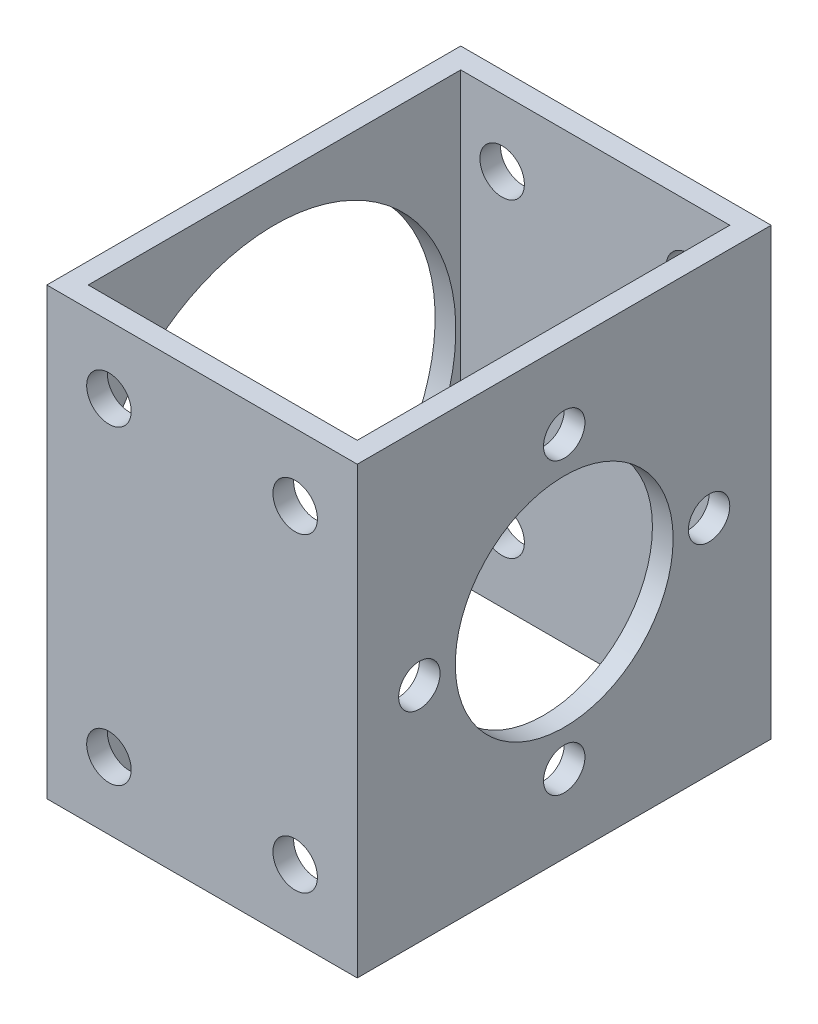
ISO-10303-21;
HEADER;
FILE_DESCRIPTION(('STEP AP214'),'2;1');
FILE_NAME('part.step','',(''),(''),'','','');
FILE_SCHEMA(('AUTOMOTIVE_DESIGN { 1 0 10303 214 1 1 1 1 }'));
ENDSEC;
DATA;
#1=APPLICATION_CONTEXT('core data for automotive mechanical design processes');
#2=APPLICATION_PROTOCOL_DEFINITION('international standard','automotive_design',2000,#1);
#3=PRODUCT_CONTEXT('',#1,'mechanical');
#4=PRODUCT('Part','Part','',(#3));
#5=PRODUCT_RELATED_PRODUCT_CATEGORY('part','',(#4));
#6=PRODUCT_DEFINITION_FORMATION('','',#4);
#7=PRODUCT_DEFINITION_CONTEXT('part definition',#1,'design');
#8=PRODUCT_DEFINITION('design','',#6,#7);
#9=PRODUCT_DEFINITION_SHAPE('','',#8);
#10=(LENGTH_UNIT() NAMED_UNIT(*) SI_UNIT(.MILLI.,.METRE.));
#11=(NAMED_UNIT(*) PLANE_ANGLE_UNIT() SI_UNIT($,.RADIAN.));
#12=(NAMED_UNIT(*) SI_UNIT($,.STERADIAN.) SOLID_ANGLE_UNIT());
#13=UNCERTAINTY_MEASURE_WITH_UNIT(LENGTH_MEASURE(1.E-05),#10,'distance_accuracy_value','');
#14=(GEOMETRIC_REPRESENTATION_CONTEXT(3) GLOBAL_UNCERTAINTY_ASSIGNED_CONTEXT((#13)) GLOBAL_UNIT_ASSIGNED_CONTEXT((#10,
#11,#12)) REPRESENTATION_CONTEXT('',''));
#15=CARTESIAN_POINT('',(0.,0.,0.));
#16=DIRECTION('',(0.,0.,1.));
#17=DIRECTION('',(1.,0.,0.));
#18=AXIS2_PLACEMENT_3D('',#15,#16,#17);
#19=CARTESIAN_POINT('',(0.,43.,0.));
#20=DIRECTION('',(0.,1.,0.));
#21=DIRECTION('',(0.,0.,1.));
#22=AXIS2_PLACEMENT_3D('',#19,#20,#21);
#23=PLANE('',#22);
#24=DIRECTION('',(0.,0.,1.));
#25=VECTOR('',#24,1.);
#26=CARTESIAN_POINT('',(0.,43.,0.));
#27=LINE('',#26,#25);
#28=CARTESIAN_POINT('',(0.,43.,0.));
#29=VERTEX_POINT('',#28);
#30=CARTESIAN_POINT('',(0.,43.,40.));
#31=VERTEX_POINT('',#30);
#32=EDGE_CURVE('E139',#29,#31,#27,.T.);
#33=ORIENTED_EDGE('',*,*,#32,.T.);
#34=DIRECTION('',(1.,0.,0.));
#35=VECTOR('',#34,1.);
#36=CARTESIAN_POINT('',(0.,43.,40.));
#37=LINE('',#36,#35);
#38=CARTESIAN_POINT('',(30.,43.,40.));
#39=VERTEX_POINT('',#38);
#40=EDGE_CURVE('E142',#31,#39,#37,.T.);
#41=ORIENTED_EDGE('',*,*,#40,.T.);
#42=DIRECTION('',(0.,0.,-1.));
#43=VECTOR('',#42,1.);
#44=CARTESIAN_POINT('',(30.,43.,0.));
#45=LINE('',#44,#43);
#46=CARTESIAN_POINT('',(30.,43.,0.));
#47=VERTEX_POINT('',#46);
#48=EDGE_CURVE('E145',#39,#47,#45,.T.);
#49=ORIENTED_EDGE('',*,*,#48,.T.);
#50=DIRECTION('',(-1.,0.,0.));
#51=VECTOR('',#50,1.);
#52=CARTESIAN_POINT('',(0.,43.,0.));
#53=LINE('',#52,#51);
#54=EDGE_CURVE('E147',#47,#29,#53,.T.);
#55=ORIENTED_EDGE('',*,*,#54,.T.);
#56=EDGE_LOOP('',(#33,#41,#49,#55));
#57=FACE_BOUND('',#56,.T.);
#58=DIRECTION('',(1.,0.,0.));
#59=VECTOR('',#58,1.);
#60=CARTESIAN_POINT('',(2.,43.,38.));
#61=LINE('',#60,#59);
#62=CARTESIAN_POINT('',(2.,43.,38.));
#63=VERTEX_POINT('',#62);
#64=CARTESIAN_POINT('',(28.,43.,38.));
#65=VERTEX_POINT('',#64);
#66=EDGE_CURVE('E109',#63,#65,#61,.T.);
#67=ORIENTED_EDGE('',*,*,#66,.F.);
#68=DIRECTION('',(0.,0.,1.));
#69=VECTOR('',#68,1.);
#70=CARTESIAN_POINT('',(2.,43.,2.));
#71=LINE('',#70,#69);
#72=CARTESIAN_POINT('',(2.,43.,2.));
#73=VERTEX_POINT('',#72);
#74=EDGE_CURVE('E101',#73,#63,#71,.T.);
#75=ORIENTED_EDGE('',*,*,#74,.F.);
#76=DIRECTION('',(-1.,0.,0.));
#77=VECTOR('',#76,1.);
#78=CARTESIAN_POINT('',(2.,43.,2.));
#79=LINE('',#78,#77);
#80=CARTESIAN_POINT('',(28.,43.,2.));
#81=VERTEX_POINT('',#80);
#82=EDGE_CURVE('E123',#81,#73,#79,.T.);
#83=ORIENTED_EDGE('',*,*,#82,.F.);
#84=DIRECTION('',(0.,0.,-1.));
#85=VECTOR('',#84,1.);
#86=CARTESIAN_POINT('',(28.,43.,2.));
#87=LINE('',#86,#85);
#88=EDGE_CURVE('E121',#65,#81,#87,.T.);
#89=ORIENTED_EDGE('',*,*,#88,.F.);
#90=EDGE_LOOP('',(#67,#75,#83,#89));
#91=FACE_BOUND('',#90,.T.);
#92=ADVANCED_FACE('F34',(#57,#91),#23,.T.);
#93=CARTESIAN_POINT('',(0.,0.,0.));
#94=DIRECTION('',(0.,1.,0.));
#95=DIRECTION('',(0.,0.,1.));
#96=AXIS2_PLACEMENT_3D('',#93,#94,#95);
#97=PLANE('',#96);
#98=DIRECTION('',(0.,0.,1.));
#99=VECTOR('',#98,1.);
#100=CARTESIAN_POINT('',(0.,0.,0.));
#101=LINE('',#100,#99);
#102=CARTESIAN_POINT('',(0.,0.,0.));
#103=VERTEX_POINT('',#102);
#104=CARTESIAN_POINT('',(0.,0.,40.));
#105=VERTEX_POINT('',#104);
#106=EDGE_CURVE('E117',#103,#105,#101,.T.);
#107=ORIENTED_EDGE('',*,*,#106,.F.);
#108=DIRECTION('',(-1.,0.,0.));
#109=VECTOR('',#108,1.);
#110=CARTESIAN_POINT('',(0.,0.,0.));
#111=LINE('',#110,#109);
#112=CARTESIAN_POINT('',(30.,0.,0.));
#113=VERTEX_POINT('',#112);
#114=EDGE_CURVE('E143',#113,#103,#111,.T.);
#115=ORIENTED_EDGE('',*,*,#114,.F.);
#116=DIRECTION('',(0.,0.,-1.));
#117=VECTOR('',#116,1.);
#118=CARTESIAN_POINT('',(30.,0.,0.));
#119=LINE('',#118,#117);
#120=CARTESIAN_POINT('',(30.,0.,40.));
#121=VERTEX_POINT('',#120);
#122=EDGE_CURVE('E154',#121,#113,#119,.T.);
#123=ORIENTED_EDGE('',*,*,#122,.F.);
#124=DIRECTION('',(1.,0.,0.));
#125=VECTOR('',#124,1.);
#126=CARTESIAN_POINT('',(0.,0.,40.));
#127=LINE('',#126,#125);
#128=EDGE_CURVE('E152',#105,#121,#127,.T.);
#129=ORIENTED_EDGE('',*,*,#128,.F.);
#130=EDGE_LOOP('',(#107,#115,#123,#129));
#131=FACE_BOUND('',#130,.T.);
#132=DIRECTION('',(0.,0.,1.));
#133=VECTOR('',#132,1.);
#134=CARTESIAN_POINT('',(2.,0.,2.));
#135=LINE('',#134,#133);
#136=CARTESIAN_POINT('',(2.,0.,2.));
#137=VERTEX_POINT('',#136);
#138=CARTESIAN_POINT('',(2.,0.,38.));
#139=VERTEX_POINT('',#138);
#140=EDGE_CURVE('E59',#137,#139,#135,.T.);
#141=ORIENTED_EDGE('',*,*,#140,.T.);
#142=DIRECTION('',(1.,0.,0.));
#143=VECTOR('',#142,1.);
#144=CARTESIAN_POINT('',(2.,0.,38.));
#145=LINE('',#144,#143);
#146=CARTESIAN_POINT('',(28.,0.,38.));
#147=VERTEX_POINT('',#146);
#148=EDGE_CURVE('E116',#139,#147,#145,.T.);
#149=ORIENTED_EDGE('',*,*,#148,.T.);
#150=DIRECTION('',(0.,0.,-1.));
#151=VECTOR('',#150,1.);
#152=CARTESIAN_POINT('',(28.,0.,2.));
#153=LINE('',#152,#151);
#154=CARTESIAN_POINT('',(28.,0.,2.));
#155=VERTEX_POINT('',#154);
#156=EDGE_CURVE('E131',#147,#155,#153,.T.);
#157=ORIENTED_EDGE('',*,*,#156,.T.);
#158=DIRECTION('',(-1.,0.,0.));
#159=VECTOR('',#158,1.);
#160=CARTESIAN_POINT('',(2.,0.,2.));
#161=LINE('',#160,#159);
#162=EDGE_CURVE('E110',#155,#137,#161,.T.);
#163=ORIENTED_EDGE('',*,*,#162,.T.);
#164=EDGE_LOOP('',(#141,#149,#157,#163));
#165=FACE_BOUND('',#164,.T.);
#166=ADVANCED_FACE('F225',(#131,#165),#97,.F.);
#167=CARTESIAN_POINT('',(0.,43.,0.));
#168=DIRECTION('',(1.,0.,0.));
#169=DIRECTION('',(0.,0.,-1.));
#170=AXIS2_PLACEMENT_3D('',#167,#168,#169);
#171=PLANE('',#170);
#172=CARTESIAN_POINT('',(0.,21.5,20.));
#173=DIRECTION('',(-1.,0.,0.));
#174=DIRECTION('',(0.,0.,1.));
#175=AXIS2_PLACEMENT_3D('',#172,#173,#174);
#176=CIRCLE('',#175,17.525);
#177=CARTESIAN_POINT('',(0.,21.5,37.525));
#178=VERTEX_POINT('',#177);
#179=EDGE_CURVE('E358',#178,#178,#176,.T.);
#180=ORIENTED_EDGE('',*,*,#179,.F.);
#181=EDGE_LOOP('',(#180));
#182=FACE_BOUND('',#181,.T.);
#183=ORIENTED_EDGE('',*,*,#106,.T.);
#184=DIRECTION('',(0.,-1.,0.));
#185=VECTOR('',#184,1.);
#186=CARTESIAN_POINT('',(0.,43.,40.));
#187=LINE('',#186,#185);
#188=EDGE_CURVE('E11',#31,#105,#187,.T.);
#189=ORIENTED_EDGE('',*,*,#188,.F.);
#190=ORIENTED_EDGE('',*,*,#32,.F.);
#191=DIRECTION('',(0.,-1.,0.));
#192=VECTOR('',#191,1.);
#193=CARTESIAN_POINT('',(0.,43.,0.));
#194=LINE('',#193,#192);
#195=EDGE_CURVE('E149',#29,#103,#194,.T.);
#196=ORIENTED_EDGE('',*,*,#195,.T.);
#197=EDGE_LOOP('',(#183,#189,#190,#196));
#198=FACE_BOUND('',#197,.T.);
#199=ADVANCED_FACE('F36',(#182,#198),#171,.F.);
#200=CARTESIAN_POINT('',(0.,43.,40.));
#201=DIRECTION('',(0.,0.,-1.));
#202=DIRECTION('',(-1.,0.,0.));
#203=AXIS2_PLACEMENT_3D('',#200,#201,#202);
#204=PLANE('',#203);
#205=CARTESIAN_POINT('',(6.,36.5,40.));
#206=DIRECTION('',(0.,0.,-1.));
#207=DIRECTION('',(-1.,0.,0.));
#208=AXIS2_PLACEMENT_3D('',#205,#206,#207);
#209=CIRCLE('',#208,2.15);
#210=CARTESIAN_POINT('',(3.85,36.5,40.));
#211=VERTEX_POINT('',#210);
#212=EDGE_CURVE('E249',#211,#211,#209,.T.);
#213=ORIENTED_EDGE('',*,*,#212,.T.);
#214=EDGE_LOOP('',(#213));
#215=FACE_BOUND('',#214,.T.);
#216=CARTESIAN_POINT('',(24.,36.5,40.));
#217=DIRECTION('',(0.,0.,-1.));
#218=DIRECTION('',(-1.,0.,0.));
#219=AXIS2_PLACEMENT_3D('',#216,#217,#218);
#220=CIRCLE('',#219,2.15);
#221=CARTESIAN_POINT('',(21.85,36.5,40.));
#222=VERTEX_POINT('',#221);
#223=EDGE_CURVE('E175',#222,#222,#220,.T.);
#224=ORIENTED_EDGE('',*,*,#223,.T.);
#225=EDGE_LOOP('',(#224));
#226=FACE_BOUND('',#225,.T.);
#227=CARTESIAN_POINT('',(24.,6.5,40.));
#228=DIRECTION('',(0.,0.,-1.));
#229=DIRECTION('',(-1.,0.,0.));
#230=AXIS2_PLACEMENT_3D('',#227,#228,#229);
#231=CIRCLE('',#230,2.15);
#232=CARTESIAN_POINT('',(21.85,6.5,40.));
#233=VERTEX_POINT('',#232);
#234=EDGE_CURVE('E171',#233,#233,#231,.T.);
#235=ORIENTED_EDGE('',*,*,#234,.T.);
#236=EDGE_LOOP('',(#235));
#237=FACE_BOUND('',#236,.T.);
#238=CARTESIAN_POINT('',(6.,6.5,40.));
#239=DIRECTION('',(0.,0.,-1.));
#240=DIRECTION('',(-1.,0.,0.));
#241=AXIS2_PLACEMENT_3D('',#238,#239,#240);
#242=CIRCLE('',#241,2.15);
#243=CARTESIAN_POINT('',(3.85,6.5,40.));
#244=VERTEX_POINT('',#243);
#245=EDGE_CURVE('E167',#244,#244,#242,.T.);
#246=ORIENTED_EDGE('',*,*,#245,.T.);
#247=EDGE_LOOP('',(#246));
#248=FACE_BOUND('',#247,.T.);
#249=ORIENTED_EDGE('',*,*,#128,.T.);
#250=DIRECTION('',(0.,-1.,0.));
#251=VECTOR('',#250,1.);
#252=CARTESIAN_POINT('',(30.,43.,40.));
#253=LINE('',#252,#251);
#254=EDGE_CURVE('E43',#39,#121,#253,.T.);
#255=ORIENTED_EDGE('',*,*,#254,.F.);
#256=ORIENTED_EDGE('',*,*,#40,.F.);
#257=ORIENTED_EDGE('',*,*,#188,.T.);
#258=EDGE_LOOP('',(#249,#255,#256,#257));
#259=FACE_BOUND('',#258,.T.);
#260=ADVANCED_FACE('F239',(#215,#226,#237,#248,#259),#204,.F.);
#261=CARTESIAN_POINT('',(30.,43.,0.));
#262=DIRECTION('',(-1.,0.,0.));
#263=DIRECTION('',(0.,0.,1.));
#264=AXIS2_PLACEMENT_3D('',#261,#262,#263);
#265=PLANE('',#264);
#266=CARTESIAN_POINT('',(30.,35.5,20.));
#267=DIRECTION('',(1.,0.,0.));
#268=DIRECTION('',(0.,0.,-1.));
#269=AXIS2_PLACEMENT_3D('',#266,#267,#268);
#270=CIRCLE('',#269,2.);
#271=CARTESIAN_POINT('',(30.,35.5,18.));
#272=VERTEX_POINT('',#271);
#273=EDGE_CURVE('E327',#272,#272,#270,.T.);
#274=ORIENTED_EDGE('',*,*,#273,.F.);
#275=EDGE_LOOP('',(#274));
#276=FACE_BOUND('',#275,.T.);
#277=CARTESIAN_POINT('',(30.,21.5,34.));
#278=DIRECTION('',(1.,0.,0.));
#279=DIRECTION('',(0.,0.,-1.));
#280=AXIS2_PLACEMENT_3D('',#277,#278,#279);
#281=CIRCLE('',#280,2.);
#282=CARTESIAN_POINT('',(30.,21.5,32.));
#283=VERTEX_POINT('',#282);
#284=EDGE_CURVE('E331',#283,#283,#281,.T.);
#285=ORIENTED_EDGE('',*,*,#284,.F.);
#286=EDGE_LOOP('',(#285));
#287=FACE_BOUND('',#286,.T.);
#288=CARTESIAN_POINT('',(30.,7.5,20.));
#289=DIRECTION('',(1.,0.,0.));
#290=DIRECTION('',(0.,0.,-1.));
#291=AXIS2_PLACEMENT_3D('',#288,#289,#290);
#292=CIRCLE('',#291,2.);
#293=CARTESIAN_POINT('',(30.,7.5,18.));
#294=VERTEX_POINT('',#293);
#295=EDGE_CURVE('E338',#294,#294,#292,.T.);
#296=ORIENTED_EDGE('',*,*,#295,.F.);
#297=EDGE_LOOP('',(#296));
#298=FACE_BOUND('',#297,.T.);
#299=CARTESIAN_POINT('',(30.,21.5,5.99999999999999));
#300=DIRECTION('',(1.,0.,0.));
#301=DIRECTION('',(0.,0.,-1.));
#302=AXIS2_PLACEMENT_3D('',#299,#300,#301);
#303=CIRCLE('',#302,2.);
#304=CARTESIAN_POINT('',(30.,21.5,3.99999999999999));
#305=VERTEX_POINT('',#304);
#306=EDGE_CURVE('E344',#305,#305,#303,.T.);
#307=ORIENTED_EDGE('',*,*,#306,.F.);
#308=EDGE_LOOP('',(#307));
#309=FACE_BOUND('',#308,.T.);
#310=CARTESIAN_POINT('',(30.,21.5,20.));
#311=DIRECTION('',(1.,0.,0.));
#312=DIRECTION('',(0.,0.,-1.));
#313=AXIS2_PLACEMENT_3D('',#310,#311,#312);
#314=CIRCLE('',#313,10.525);
#315=CARTESIAN_POINT('',(30.,21.5,9.475));
#316=VERTEX_POINT('',#315);
#317=EDGE_CURVE('E350',#316,#316,#314,.T.);
#318=ORIENTED_EDGE('',*,*,#317,.F.);
#319=EDGE_LOOP('',(#318));
#320=FACE_BOUND('',#319,.T.);
#321=ORIENTED_EDGE('',*,*,#122,.T.);
#322=DIRECTION('',(0.,-1.,0.));
#323=VECTOR('',#322,1.);
#324=CARTESIAN_POINT('',(30.,43.,0.));
#325=LINE('',#324,#323);
#326=EDGE_CURVE('E159',#47,#113,#325,.T.);
#327=ORIENTED_EDGE('',*,*,#326,.F.);
#328=ORIENTED_EDGE('',*,*,#48,.F.);
#329=ORIENTED_EDGE('',*,*,#254,.T.);
#330=EDGE_LOOP('',(#321,#327,#328,#329));
#331=FACE_BOUND('',#330,.T.);
#332=ADVANCED_FACE('F236',(#276,#287,#298,#309,#320,#331),#265,.F.);
#333=CARTESIAN_POINT('',(0.,43.,0.));
#334=DIRECTION('',(0.,0.,1.));
#335=DIRECTION('',(1.,0.,0.));
#336=AXIS2_PLACEMENT_3D('',#333,#334,#335);
#337=PLANE('',#336);
#338=CARTESIAN_POINT('',(6.,36.5,0.));
#339=DIRECTION('',(0.,0.,-1.));
#340=DIRECTION('',(-1.,0.,0.));
#341=AXIS2_PLACEMENT_3D('',#338,#339,#340);
#342=CIRCLE('',#341,2.15);
#343=CARTESIAN_POINT('',(3.85,36.5,0.));
#344=VERTEX_POINT('',#343);
#345=EDGE_CURVE('E361',#344,#344,#342,.T.);
#346=ORIENTED_EDGE('',*,*,#345,.F.);
#347=EDGE_LOOP('',(#346));
#348=FACE_BOUND('',#347,.T.);
#349=CARTESIAN_POINT('',(24.,36.5,0.));
#350=DIRECTION('',(0.,0.,-1.));
#351=DIRECTION('',(-1.,0.,0.));
#352=AXIS2_PLACEMENT_3D('',#349,#350,#351);
#353=CIRCLE('',#352,2.15);
#354=CARTESIAN_POINT('',(21.85,36.5,0.));
#355=VERTEX_POINT('',#354);
#356=EDGE_CURVE('E182',#355,#355,#353,.T.);
#357=ORIENTED_EDGE('',*,*,#356,.F.);
#358=EDGE_LOOP('',(#357));
#359=FACE_BOUND('',#358,.T.);
#360=CARTESIAN_POINT('',(24.,6.5,0.));
#361=DIRECTION('',(0.,0.,-1.));
#362=DIRECTION('',(-1.,0.,0.));
#363=AXIS2_PLACEMENT_3D('',#360,#361,#362);
#364=CIRCLE('',#363,2.15);
#365=CARTESIAN_POINT('',(21.85,6.5,0.));
#366=VERTEX_POINT('',#365);
#367=EDGE_CURVE('E179',#366,#366,#364,.T.);
#368=ORIENTED_EDGE('',*,*,#367,.F.);
#369=EDGE_LOOP('',(#368));
#370=FACE_BOUND('',#369,.T.);
#371=CARTESIAN_POINT('',(6.,6.5,0.));
#372=DIRECTION('',(0.,0.,-1.));
#373=DIRECTION('',(-1.,0.,0.));
#374=AXIS2_PLACEMENT_3D('',#371,#372,#373);
#375=CIRCLE('',#374,2.15);
#376=CARTESIAN_POINT('',(3.85,6.5,0.));
#377=VERTEX_POINT('',#376);
#378=EDGE_CURVE('E198',#377,#377,#375,.T.);
#379=ORIENTED_EDGE('',*,*,#378,.F.);
#380=EDGE_LOOP('',(#379));
#381=FACE_BOUND('',#380,.T.);
#382=ORIENTED_EDGE('',*,*,#114,.T.);
#383=ORIENTED_EDGE('',*,*,#195,.F.);
#384=ORIENTED_EDGE('',*,*,#54,.F.);
#385=ORIENTED_EDGE('',*,*,#326,.T.);
#386=EDGE_LOOP('',(#382,#383,#384,#385));
#387=FACE_BOUND('',#386,.T.);
#388=ADVANCED_FACE('F219',(#348,#359,#370,#381,#387),#337,.F.);
#389=CARTESIAN_POINT('',(2.,43.,2.));
#390=DIRECTION('',(1.,0.,0.));
#391=DIRECTION('',(0.,0.,-1.));
#392=AXIS2_PLACEMENT_3D('',#389,#390,#391);
#393=PLANE('',#392);
#394=CARTESIAN_POINT('',(2.,21.5,20.));
#395=DIRECTION('',(1.,0.,0.));
#396=DIRECTION('',(0.,0.,-1.));
#397=AXIS2_PLACEMENT_3D('',#394,#395,#396);
#398=CIRCLE('',#397,17.525);
#399=CARTESIAN_POINT('',(2.,21.5,37.525));
#400=VERTEX_POINT('',#399);
#401=EDGE_CURVE('E353',#400,#400,#398,.F.);
#402=ORIENTED_EDGE('',*,*,#401,.T.);
#403=EDGE_LOOP('',(#402));
#404=FACE_BOUND('',#403,.T.);
#405=ORIENTED_EDGE('',*,*,#140,.F.);
#406=DIRECTION('',(0.,-1.,0.));
#407=VECTOR('',#406,1.);
#408=CARTESIAN_POINT('',(2.,43.,2.));
#409=LINE('',#408,#407);
#410=EDGE_CURVE('E105',#73,#137,#409,.T.);
#411=ORIENTED_EDGE('',*,*,#410,.F.);
#412=ORIENTED_EDGE('',*,*,#74,.T.);
#413=DIRECTION('',(0.,-1.,0.));
#414=VECTOR('',#413,1.);
#415=CARTESIAN_POINT('',(2.,43.,38.));
#416=LINE('',#415,#414);
#417=EDGE_CURVE('E104',#63,#139,#416,.T.);
#418=ORIENTED_EDGE('',*,*,#417,.T.);
#419=EDGE_LOOP('',(#405,#411,#412,#418));
#420=FACE_BOUND('',#419,.T.);
#421=ADVANCED_FACE('F103',(#404,#420),#393,.T.);
#422=CARTESIAN_POINT('',(2.,43.,38.));
#423=DIRECTION('',(0.,0.,-1.));
#424=DIRECTION('',(-1.,0.,0.));
#425=AXIS2_PLACEMENT_3D('',#422,#423,#424);
#426=PLANE('',#425);
#427=CARTESIAN_POINT('',(6.,36.5,38.));
#428=DIRECTION('',(0.,0.,-1.));
#429=DIRECTION('',(-1.,0.,0.));
#430=AXIS2_PLACEMENT_3D('',#427,#428,#429);
#431=CIRCLE('',#430,2.15);
#432=CARTESIAN_POINT('',(3.85,36.5,38.));
#433=VERTEX_POINT('',#432);
#434=EDGE_CURVE('E187',#433,#433,#431,.T.);
#435=ORIENTED_EDGE('',*,*,#434,.F.);
#436=EDGE_LOOP('',(#435));
#437=FACE_BOUND('',#436,.T.);
#438=CARTESIAN_POINT('',(24.,36.5,38.));
#439=DIRECTION('',(0.,0.,-1.));
#440=DIRECTION('',(-1.,0.,0.));
#441=AXIS2_PLACEMENT_3D('',#438,#439,#440);
#442=CIRCLE('',#441,2.15);
#443=CARTESIAN_POINT('',(21.85,36.5,38.));
#444=VERTEX_POINT('',#443);
#445=EDGE_CURVE('E174',#444,#444,#442,.T.);
#446=ORIENTED_EDGE('',*,*,#445,.F.);
#447=EDGE_LOOP('',(#446));
#448=FACE_BOUND('',#447,.T.);
#449=CARTESIAN_POINT('',(24.,6.5,38.));
#450=DIRECTION('',(0.,0.,-1.));
#451=DIRECTION('',(-1.,0.,0.));
#452=AXIS2_PLACEMENT_3D('',#449,#450,#451);
#453=CIRCLE('',#452,2.15);
#454=CARTESIAN_POINT('',(21.85,6.5,38.));
#455=VERTEX_POINT('',#454);
#456=EDGE_CURVE('E170',#455,#455,#453,.T.);
#457=ORIENTED_EDGE('',*,*,#456,.F.);
#458=EDGE_LOOP('',(#457));
#459=FACE_BOUND('',#458,.T.);
#460=CARTESIAN_POINT('',(6.,6.5,38.));
#461=DIRECTION('',(0.,0.,-1.));
#462=DIRECTION('',(-1.,0.,0.));
#463=AXIS2_PLACEMENT_3D('',#460,#461,#462);
#464=CIRCLE('',#463,2.15);
#465=CARTESIAN_POINT('',(3.85,6.5,38.));
#466=VERTEX_POINT('',#465);
#467=EDGE_CURVE('E129',#466,#466,#464,.T.);
#468=ORIENTED_EDGE('',*,*,#467,.F.);
#469=EDGE_LOOP('',(#468));
#470=FACE_BOUND('',#469,.T.);
#471=ORIENTED_EDGE('',*,*,#148,.F.);
#472=ORIENTED_EDGE('',*,*,#417,.F.);
#473=ORIENTED_EDGE('',*,*,#66,.T.);
#474=DIRECTION('',(0.,-1.,0.));
#475=VECTOR('',#474,1.);
#476=CARTESIAN_POINT('',(28.,43.,38.));
#477=LINE('',#476,#475);
#478=EDGE_CURVE('E118',#65,#147,#477,.T.);
#479=ORIENTED_EDGE('',*,*,#478,.T.);
#480=EDGE_LOOP('',(#471,#472,#473,#479));
#481=FACE_BOUND('',#480,.T.);
#482=ADVANCED_FACE('F113',(#437,#448,#459,#470,#481),#426,.T.);
#483=CARTESIAN_POINT('',(28.,43.,2.));
#484=DIRECTION('',(-1.,0.,0.));
#485=DIRECTION('',(0.,0.,1.));
#486=AXIS2_PLACEMENT_3D('',#483,#484,#485);
#487=PLANE('',#486);
#488=CARTESIAN_POINT('',(28.,35.5,20.));
#489=DIRECTION('',(-1.,0.,0.));
#490=DIRECTION('',(0.,0.,1.));
#491=AXIS2_PLACEMENT_3D('',#488,#489,#490);
#492=CIRCLE('',#491,2.);
#493=CARTESIAN_POINT('',(28.,35.5,22.));
#494=VERTEX_POINT('',#493);
#495=EDGE_CURVE('E324',#494,#494,#492,.F.);
#496=ORIENTED_EDGE('',*,*,#495,.T.);
#497=EDGE_LOOP('',(#496));
#498=FACE_BOUND('',#497,.T.);
#499=CARTESIAN_POINT('',(28.,21.5,34.));
#500=DIRECTION('',(-1.,0.,0.));
#501=DIRECTION('',(0.,0.,1.));
#502=AXIS2_PLACEMENT_3D('',#499,#500,#501);
#503=CIRCLE('',#502,2.);
#504=CARTESIAN_POINT('',(28.,21.5,36.));
#505=VERTEX_POINT('',#504);
#506=EDGE_CURVE('E328',#505,#505,#503,.F.);
#507=ORIENTED_EDGE('',*,*,#506,.T.);
#508=EDGE_LOOP('',(#507));
#509=FACE_BOUND('',#508,.T.);
#510=CARTESIAN_POINT('',(28.,7.5,20.));
#511=DIRECTION('',(-1.,0.,0.));
#512=DIRECTION('',(0.,0.,1.));
#513=AXIS2_PLACEMENT_3D('',#510,#511,#512);
#514=CIRCLE('',#513,2.);
#515=CARTESIAN_POINT('',(28.,7.5,22.));
#516=VERTEX_POINT('',#515);
#517=EDGE_CURVE('E336',#516,#516,#514,.F.);
#518=ORIENTED_EDGE('',*,*,#517,.T.);
#519=EDGE_LOOP('',(#518));
#520=FACE_BOUND('',#519,.T.);
#521=CARTESIAN_POINT('',(28.,21.5,5.99999999999999));
#522=DIRECTION('',(-1.,0.,0.));
#523=DIRECTION('',(0.,0.,1.));
#524=AXIS2_PLACEMENT_3D('',#521,#522,#523);
#525=CIRCLE('',#524,2.);
#526=CARTESIAN_POINT('',(28.,21.5,8.));
#527=VERTEX_POINT('',#526);
#528=EDGE_CURVE('E341',#527,#527,#525,.F.);
#529=ORIENTED_EDGE('',*,*,#528,.T.);
#530=EDGE_LOOP('',(#529));
#531=FACE_BOUND('',#530,.T.);
#532=CARTESIAN_POINT('',(28.,21.5,20.));
#533=DIRECTION('',(-1.,0.,0.));
#534=DIRECTION('',(0.,0.,1.));
#535=AXIS2_PLACEMENT_3D('',#532,#533,#534);
#536=CIRCLE('',#535,10.525);
#537=CARTESIAN_POINT('',(28.,21.5,30.525));
#538=VERTEX_POINT('',#537);
#539=EDGE_CURVE('E347',#538,#538,#536,.F.);
#540=ORIENTED_EDGE('',*,*,#539,.T.);
#541=EDGE_LOOP('',(#540));
#542=FACE_BOUND('',#541,.T.);
#543=ORIENTED_EDGE('',*,*,#156,.F.);
#544=ORIENTED_EDGE('',*,*,#478,.F.);
#545=ORIENTED_EDGE('',*,*,#88,.T.);
#546=DIRECTION('',(0.,-1.,0.));
#547=VECTOR('',#546,1.);
#548=CARTESIAN_POINT('',(28.,43.,2.));
#549=LINE('',#548,#547);
#550=EDGE_CURVE('E51',#81,#155,#549,.T.);
#551=ORIENTED_EDGE('',*,*,#550,.T.);
#552=EDGE_LOOP('',(#543,#544,#545,#551));
#553=FACE_BOUND('',#552,.T.);
#554=ADVANCED_FACE('F209',(#498,#509,#520,#531,#542,#553),#487,.T.);
#555=CARTESIAN_POINT('',(2.,43.,2.));
#556=DIRECTION('',(0.,0.,1.));
#557=DIRECTION('',(1.,0.,0.));
#558=AXIS2_PLACEMENT_3D('',#555,#556,#557);
#559=PLANE('',#558);
#560=CARTESIAN_POINT('',(6.,36.5,2.));
#561=DIRECTION('',(0.,0.,1.));
#562=DIRECTION('',(1.,0.,0.));
#563=AXIS2_PLACEMENT_3D('',#560,#561,#562);
#564=CIRCLE('',#563,2.15);
#565=CARTESIAN_POINT('',(8.15,36.5,2.));
#566=VERTEX_POINT('',#565);
#567=EDGE_CURVE('E38',#566,#566,#564,.T.);
#568=ORIENTED_EDGE('',*,*,#567,.F.);
#569=EDGE_LOOP('',(#568));
#570=FACE_BOUND('',#569,.T.);
#571=CARTESIAN_POINT('',(24.,36.5,2.));
#572=DIRECTION('',(0.,0.,1.));
#573=DIRECTION('',(1.,0.,0.));
#574=AXIS2_PLACEMENT_3D('',#571,#572,#573);
#575=CIRCLE('',#574,2.15);
#576=CARTESIAN_POINT('',(26.15,36.5,2.));
#577=VERTEX_POINT('',#576);
#578=EDGE_CURVE('E172',#577,#577,#575,.T.);
#579=ORIENTED_EDGE('',*,*,#578,.F.);
#580=EDGE_LOOP('',(#579));
#581=FACE_BOUND('',#580,.T.);
#582=CARTESIAN_POINT('',(24.,6.5,2.));
#583=DIRECTION('',(0.,0.,1.));
#584=DIRECTION('',(1.,0.,0.));
#585=AXIS2_PLACEMENT_3D('',#582,#583,#584);
#586=CIRCLE('',#585,2.15);
#587=CARTESIAN_POINT('',(26.15,6.5,2.));
#588=VERTEX_POINT('',#587);
#589=EDGE_CURVE('E168',#588,#588,#586,.T.);
#590=ORIENTED_EDGE('',*,*,#589,.F.);
#591=EDGE_LOOP('',(#590));
#592=FACE_BOUND('',#591,.T.);
#593=CARTESIAN_POINT('',(6.,6.5,2.));
#594=DIRECTION('',(0.,0.,1.));
#595=DIRECTION('',(1.,0.,0.));
#596=AXIS2_PLACEMENT_3D('',#593,#594,#595);
#597=CIRCLE('',#596,2.15);
#598=CARTESIAN_POINT('',(8.15,6.5,2.));
#599=VERTEX_POINT('',#598);
#600=EDGE_CURVE('E164',#599,#599,#597,.T.);
#601=ORIENTED_EDGE('',*,*,#600,.F.);
#602=EDGE_LOOP('',(#601));
#603=FACE_BOUND('',#602,.T.);
#604=ORIENTED_EDGE('',*,*,#162,.F.);
#605=ORIENTED_EDGE('',*,*,#550,.F.);
#606=ORIENTED_EDGE('',*,*,#82,.T.);
#607=ORIENTED_EDGE('',*,*,#410,.T.);
#608=EDGE_LOOP('',(#604,#605,#606,#607));
#609=FACE_BOUND('',#608,.T.);
#610=ADVANCED_FACE('F216',(#570,#581,#592,#603,#609),#559,.T.);
#611=CARTESIAN_POINT('',(6.,6.5,40.));
#612=DIRECTION('',(0.,0.,-1.));
#613=DIRECTION('',(-1.,0.,0.));
#614=AXIS2_PLACEMENT_3D('',#611,#612,#613);
#615=CYLINDRICAL_SURFACE('',#614,2.15);
#616=ORIENTED_EDGE('',*,*,#600,.T.);
#617=EDGE_LOOP('',(#616));
#618=FACE_BOUND('',#617,.T.);
#619=ORIENTED_EDGE('',*,*,#378,.T.);
#620=EDGE_LOOP('',(#619));
#621=FACE_BOUND('',#620,.T.);
#622=ADVANCED_FACE('F271',(#618,#621),#615,.F.);
#623=ORIENTED_EDGE('',*,*,#467,.T.);
#624=EDGE_LOOP('',(#623));
#625=FACE_BOUND('',#624,.T.);
#626=ORIENTED_EDGE('',*,*,#245,.F.);
#627=EDGE_LOOP('',(#626));
#628=FACE_BOUND('',#627,.T.);
#629=ADVANCED_FACE('F205',(#625,#628),#615,.F.);
#630=CARTESIAN_POINT('',(24.,6.5,40.));
#631=DIRECTION('',(0.,0.,-1.));
#632=DIRECTION('',(-1.,0.,0.));
#633=AXIS2_PLACEMENT_3D('',#630,#631,#632);
#634=CYLINDRICAL_SURFACE('',#633,2.15);
#635=ORIENTED_EDGE('',*,*,#589,.T.);
#636=EDGE_LOOP('',(#635));
#637=FACE_BOUND('',#636,.T.);
#638=ORIENTED_EDGE('',*,*,#367,.T.);
#639=EDGE_LOOP('',(#638));
#640=FACE_BOUND('',#639,.T.);
#641=ADVANCED_FACE('F282',(#637,#640),#634,.F.);
#642=ORIENTED_EDGE('',*,*,#456,.T.);
#643=EDGE_LOOP('',(#642));
#644=FACE_BOUND('',#643,.T.);
#645=ORIENTED_EDGE('',*,*,#234,.F.);
#646=EDGE_LOOP('',(#645));
#647=FACE_BOUND('',#646,.T.);
#648=ADVANCED_FACE('F285',(#644,#647),#634,.F.);
#649=CARTESIAN_POINT('',(24.,36.5,40.));
#650=DIRECTION('',(0.,0.,-1.));
#651=DIRECTION('',(-1.,0.,0.));
#652=AXIS2_PLACEMENT_3D('',#649,#650,#651);
#653=CYLINDRICAL_SURFACE('',#652,2.15);
#654=ORIENTED_EDGE('',*,*,#578,.T.);
#655=EDGE_LOOP('',(#654));
#656=FACE_BOUND('',#655,.T.);
#657=ORIENTED_EDGE('',*,*,#356,.T.);
#658=EDGE_LOOP('',(#657));
#659=FACE_BOUND('',#658,.T.);
#660=ADVANCED_FACE('F287',(#656,#659),#653,.F.);
#661=ORIENTED_EDGE('',*,*,#445,.T.);
#662=EDGE_LOOP('',(#661));
#663=FACE_BOUND('',#662,.T.);
#664=ORIENTED_EDGE('',*,*,#223,.F.);
#665=EDGE_LOOP('',(#664));
#666=FACE_BOUND('',#665,.T.);
#667=ADVANCED_FACE('F290',(#663,#666),#653,.F.);
#668=CARTESIAN_POINT('',(6.,36.5,40.));
#669=DIRECTION('',(0.,0.,-1.));
#670=DIRECTION('',(-1.,0.,0.));
#671=AXIS2_PLACEMENT_3D('',#668,#669,#670);
#672=CYLINDRICAL_SURFACE('',#671,2.15);
#673=ORIENTED_EDGE('',*,*,#567,.T.);
#674=EDGE_LOOP('',(#673));
#675=FACE_BOUND('',#674,.T.);
#676=ORIENTED_EDGE('',*,*,#345,.T.);
#677=EDGE_LOOP('',(#676));
#678=FACE_BOUND('',#677,.T.);
#679=ADVANCED_FACE('F291',(#675,#678),#672,.F.);
#680=ORIENTED_EDGE('',*,*,#434,.T.);
#681=EDGE_LOOP('',(#680));
#682=FACE_BOUND('',#681,.T.);
#683=ORIENTED_EDGE('',*,*,#212,.F.);
#684=EDGE_LOOP('',(#683));
#685=FACE_BOUND('',#684,.T.);
#686=ADVANCED_FACE('F294',(#682,#685),#672,.F.);
#687=CARTESIAN_POINT('',(30.001,21.5,20.));
#688=DIRECTION('',(-1.,0.,0.));
#689=DIRECTION('',(0.,0.,1.));
#690=AXIS2_PLACEMENT_3D('',#687,#688,#689);
#691=CYLINDRICAL_SURFACE('',#690,17.525);
#692=CARTESIAN_POINT('',(2.,21.5,37.525));
#693=CARTESIAN_POINT('',(1.97916666666667,21.5,37.525));
#694=CARTESIAN_POINT('',(1.95833333333334,21.5,37.525));
#695=CARTESIAN_POINT('',(1.91666666666667,21.5,37.525));
#696=CARTESIAN_POINT('',(1.89583333333334,21.5,37.525));
#697=CARTESIAN_POINT('',(1.85416666666667,21.5,37.525));
#698=CARTESIAN_POINT('',(1.83333333333334,21.5,37.525));
#699=CARTESIAN_POINT('',(1.79166666666667,21.5,37.525));
#700=CARTESIAN_POINT('',(1.77083333333334,21.5,37.525));
#701=CARTESIAN_POINT('',(1.72916666666667,21.5,37.525));
#702=CARTESIAN_POINT('',(1.70833333333333,21.5,37.525));
#703=CARTESIAN_POINT('',(1.66666666666667,21.5,37.525));
#704=CARTESIAN_POINT('',(1.64583333333333,21.5,37.525));
#705=CARTESIAN_POINT('',(1.60416666666667,21.5,37.525));
#706=CARTESIAN_POINT('',(1.58333333333333,21.5,37.525));
#707=CARTESIAN_POINT('',(1.54166666666667,21.5,37.525));
#708=CARTESIAN_POINT('',(1.52083333333333,21.5,37.525));
#709=CARTESIAN_POINT('',(1.47916666666667,21.5,37.525));
#710=CARTESIAN_POINT('',(1.45833333333334,21.5,37.525));
#711=CARTESIAN_POINT('',(1.41666666666667,21.5,37.525));
#712=CARTESIAN_POINT('',(1.39583333333334,21.5,37.525));
#713=CARTESIAN_POINT('',(1.35416666666667,21.5,37.525));
#714=CARTESIAN_POINT('',(1.33333333333334,21.5,37.525));
#715=CARTESIAN_POINT('',(1.29166666666667,21.5,37.525));
#716=CARTESIAN_POINT('',(1.27083333333334,21.5,37.525));
#717=CARTESIAN_POINT('',(1.22916666666667,21.5,37.525));
#718=CARTESIAN_POINT('',(1.20833333333334,21.5,37.525));
#719=CARTESIAN_POINT('',(1.16666666666667,21.5,37.525));
#720=CARTESIAN_POINT('',(1.14583333333334,21.5,37.525));
#721=CARTESIAN_POINT('',(1.10416666666667,21.5,37.525));
#722=CARTESIAN_POINT('',(1.08333333333334,21.5,37.525));
#723=CARTESIAN_POINT('',(1.04166666666667,21.5,37.525));
#724=CARTESIAN_POINT('',(1.02083333333334,21.5,37.525));
#725=CARTESIAN_POINT('',(0.979166666666671,21.5,37.525));
#726=CARTESIAN_POINT('',(0.958333333333338,21.5,37.525));
#727=CARTESIAN_POINT('',(0.916666666666671,21.5,37.525));
#728=CARTESIAN_POINT('',(0.895833333333338,21.5,37.525));
#729=CARTESIAN_POINT('',(0.854166666666671,21.5,37.525));
#730=CARTESIAN_POINT('',(0.833333333333337,21.5,37.525));
#731=CARTESIAN_POINT('',(0.791666666666671,21.5,37.525));
#732=CARTESIAN_POINT('',(0.770833333333337,21.5,37.525));
#733=CARTESIAN_POINT('',(0.729166666666671,21.5,37.525));
#734=CARTESIAN_POINT('',(0.708333333333337,21.5,37.525));
#735=CARTESIAN_POINT('',(0.666666666666671,21.5,37.525));
#736=CARTESIAN_POINT('',(0.645833333333337,21.5,37.525));
#737=CARTESIAN_POINT('',(0.604166666666671,21.5,37.525));
#738=CARTESIAN_POINT('',(0.583333333333337,21.5,37.525));
#739=CARTESIAN_POINT('',(0.541666666666672,21.5,37.525));
#740=CARTESIAN_POINT('',(0.52083333333334,21.5,37.525));
#741=CARTESIAN_POINT('',(0.479166666666674,21.5,37.525));
#742=CARTESIAN_POINT('',(0.458333333333341,21.5,37.525));
#743=CARTESIAN_POINT('',(0.416666666666674,21.5,37.525));
#744=CARTESIAN_POINT('',(0.395833333333341,21.5,37.525));
#745=CARTESIAN_POINT('',(0.354166666666674,21.5,37.525));
#746=CARTESIAN_POINT('',(0.333333333333341,21.5,37.525));
#747=CARTESIAN_POINT('',(0.291666666666674,21.5,37.525));
#748=CARTESIAN_POINT('',(0.270833333333341,21.5,37.525));
#749=CARTESIAN_POINT('',(0.229166666666674,21.5,37.525));
#750=CARTESIAN_POINT('',(0.20833333333334,21.5,37.525));
#751=CARTESIAN_POINT('',(0.166666666666674,21.5,37.525));
#752=CARTESIAN_POINT('',(0.14583333333334,21.5,37.525));
#753=CARTESIAN_POINT('',(0.104166666666674,21.5,37.525));
#754=CARTESIAN_POINT('',(0.0833333333333404,21.5,37.525));
#755=CARTESIAN_POINT('',(0.0416666666666736,21.5,37.525));
#756=CARTESIAN_POINT('',(0.0208333333333403,21.5,37.525));
#757=CARTESIAN_POINT('',(0.,21.5,37.525));
#758=B_SPLINE_CURVE_WITH_KNOTS('',3,(#692,#693,#694,#695,#696,#697,#698,#699,#700,#701,#702,
#703,#704,#705,#706,#707,#708,#709,#710,#711,#712,#713,#714,#715,#716,#717,#718,#719,#720,#721,
#722,#723,#724,#725,#726,#727,#728,#729,#730,#731,#732,#733,#734,#735,#736,#737,#738,#739,#740,
#741,#742,#743,#744,#745,#746,#747,#748,#749,#750,#751,#752,#753,#754,#755,#756,#757),
.UNSPECIFIED.,.F.,.F.,(4,2,2,2,2,2,2,2,2,2,2,2,2,2,2,2,2,2,2,2,2,2,2,2,2,2,2,2,2,2,2,2,4),(0.,
0.0625000000000001,0.125,0.1875,0.25,0.3125,0.375,0.4375,0.5,0.562499999999997,
0.624999999999997,0.687499999999997,0.749999999999997,0.812499999999997,0.874999999999997,
0.937499999999997,0.999999999999997,1.0625,1.125,1.1875,1.25,1.3125,1.375,1.4375,
1.49999999999999,1.56249999999999,1.62499999999999,1.68749999999999,1.74999999999999,
1.81249999999999,1.87499999999999,1.93749999999999,1.99999999999999),.UNSPECIFIED.);
#759=EDGE_CURVE('BSEAM296',#400,#178,#758,.T.);
#760=ORIENTED_EDGE('',*,*,#401,.F.);
#761=ORIENTED_EDGE('',*,*,#179,.T.);
#762=ORIENTED_EDGE('',*,*,#759,.T.);
#763=ORIENTED_EDGE('',*,*,#759,.F.);
#764=EDGE_LOOP('',(#760,#762,#761,#763));
#765=FACE_BOUND('',#764,.T.);
#766=ADVANCED_FACE('F296',(#765),#691,.F.);
#767=CARTESIAN_POINT('',(-0.00100000000000447,21.5,20.));
#768=DIRECTION('',(1.,0.,0.));
#769=DIRECTION('',(0.,0.,-1.));
#770=AXIS2_PLACEMENT_3D('',#767,#768,#769);
#771=CYLINDRICAL_SURFACE('',#770,10.525);
#772=ORIENTED_EDGE('',*,*,#539,.F.);
#773=EDGE_LOOP('',(#772));
#774=FACE_BOUND('',#773,.T.);
#775=ORIENTED_EDGE('',*,*,#317,.T.);
#776=EDGE_LOOP('',(#775));
#777=FACE_BOUND('',#776,.T.);
#778=ADVANCED_FACE('F299',(#774,#777),#771,.F.);
#779=CARTESIAN_POINT('',(-0.00100000000000794,21.5,6.));
#780=DIRECTION('',(1.,0.,0.));
#781=DIRECTION('',(0.,0.,-1.));
#782=AXIS2_PLACEMENT_3D('',#779,#780,#781);
#783=CYLINDRICAL_SURFACE('',#782,2.);
#784=ORIENTED_EDGE('',*,*,#528,.F.);
#785=EDGE_LOOP('',(#784));
#786=FACE_BOUND('',#785,.T.);
#787=ORIENTED_EDGE('',*,*,#306,.T.);
#788=EDGE_LOOP('',(#787));
#789=FACE_BOUND('',#788,.T.);
#790=ADVANCED_FACE('F303',(#786,#789),#783,.F.);
#791=CARTESIAN_POINT('',(-0.00100000000000794,7.5,20.));
#792=DIRECTION('',(1.,0.,0.));
#793=DIRECTION('',(0.,0.,-1.));
#794=AXIS2_PLACEMENT_3D('',#791,#792,#793);
#795=CYLINDRICAL_SURFACE('',#794,2.);
#796=ORIENTED_EDGE('',*,*,#517,.F.);
#797=EDGE_LOOP('',(#796));
#798=FACE_BOUND('',#797,.T.);
#799=ORIENTED_EDGE('',*,*,#295,.T.);
#800=EDGE_LOOP('',(#799));
#801=FACE_BOUND('',#800,.T.);
#802=ADVANCED_FACE('F307',(#798,#801),#795,.F.);
#803=CARTESIAN_POINT('',(-0.00100000000000447,21.5,34.));
#804=DIRECTION('',(1.,0.,0.));
#805=DIRECTION('',(0.,0.,-1.));
#806=AXIS2_PLACEMENT_3D('',#803,#804,#805);
#807=CYLINDRICAL_SURFACE('',#806,2.);
#808=ORIENTED_EDGE('',*,*,#506,.F.);
#809=EDGE_LOOP('',(#808));
#810=FACE_BOUND('',#809,.T.);
#811=ORIENTED_EDGE('',*,*,#284,.T.);
#812=EDGE_LOOP('',(#811));
#813=FACE_BOUND('',#812,.T.);
#814=ADVANCED_FACE('F311',(#810,#813),#807,.F.);
#815=CARTESIAN_POINT('',(-0.00100000000000794,35.5,20.));
#816=DIRECTION('',(1.,0.,0.));
#817=DIRECTION('',(0.,0.,-1.));
#818=AXIS2_PLACEMENT_3D('',#815,#816,#817);
#819=CYLINDRICAL_SURFACE('',#818,2.);
#820=ORIENTED_EDGE('',*,*,#495,.F.);
#821=EDGE_LOOP('',(#820));
#822=FACE_BOUND('',#821,.T.);
#823=ORIENTED_EDGE('',*,*,#273,.T.);
#824=EDGE_LOOP('',(#823));
#825=FACE_BOUND('',#824,.T.);
#826=ADVANCED_FACE('F315',(#822,#825),#819,.F.);
#827=CLOSED_SHELL('',(#92,#166,#199,#260,#332,#388,#421,#482,#554,#610,#622,#629,#641,#648,#660,
#667,#679,#686,#766,#778,#790,#802,#814,#826));
#828=MANIFOLD_SOLID_BREP('B2',#827);
#829=ADVANCED_BREP_SHAPE_REPRESENTATION('',(#18,#828),#14);
#830=SHAPE_DEFINITION_REPRESENTATION(#9,#829);
ENDSEC;
END-ISO-10303-21;
